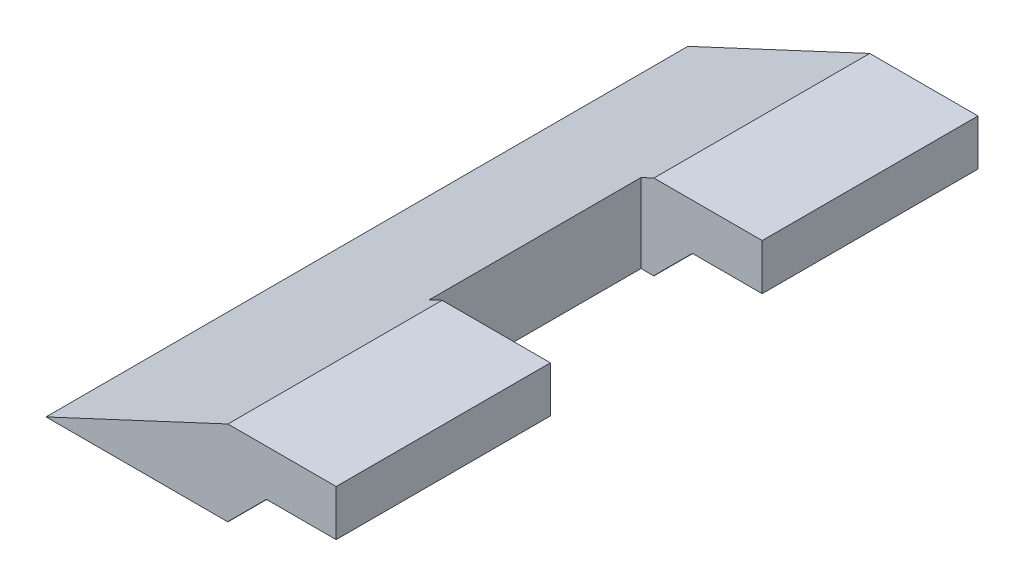
ISO-10303-21;
HEADER;
FILE_DESCRIPTION(('STEP AP214'),'2;1');
FILE_NAME('part.step','',(''),(''),'','','');
FILE_SCHEMA(('AUTOMOTIVE_DESIGN { 1 0 10303 214 1 1 1 1 }'));
ENDSEC;
DATA;
#1=APPLICATION_CONTEXT('core data for automotive mechanical design processes');
#2=APPLICATION_PROTOCOL_DEFINITION('international standard','automotive_design',2000,#1);
#3=PRODUCT_CONTEXT('',#1,'mechanical');
#4=PRODUCT('Part','Part','',(#3));
#5=PRODUCT_RELATED_PRODUCT_CATEGORY('part','',(#4));
#6=PRODUCT_DEFINITION_FORMATION('','',#4);
#7=PRODUCT_DEFINITION_CONTEXT('part definition',#1,'design');
#8=PRODUCT_DEFINITION('design','',#6,#7);
#9=PRODUCT_DEFINITION_SHAPE('','',#8);
#10=(LENGTH_UNIT() NAMED_UNIT(*) SI_UNIT(.MILLI.,.METRE.));
#11=(NAMED_UNIT(*) PLANE_ANGLE_UNIT() SI_UNIT($,.RADIAN.));
#12=(NAMED_UNIT(*) SI_UNIT($,.STERADIAN.) SOLID_ANGLE_UNIT());
#13=UNCERTAINTY_MEASURE_WITH_UNIT(LENGTH_MEASURE(1.E-05),#10,'distance_accuracy_value','');
#14=(GEOMETRIC_REPRESENTATION_CONTEXT(3) GLOBAL_UNCERTAINTY_ASSIGNED_CONTEXT((#13)) GLOBAL_UNIT_ASSIGNED_CONTEXT((#10,
#11,#12)) REPRESENTATION_CONTEXT('',''));
#15=CARTESIAN_POINT('',(0.,0.,0.));
#16=DIRECTION('',(0.,0.,1.));
#17=DIRECTION('',(1.,0.,0.));
#18=AXIS2_PLACEMENT_3D('',#15,#16,#17);
#19=CARTESIAN_POINT('',(-11.3020310443473,-4.30356435566631,50.));
#20=DIRECTION('',(0.,1.,0.));
#21=DIRECTION('',(-1.,0.,0.));
#22=AXIS2_PLACEMENT_3D('',#19,#20,#21);
#23=PLANE('',#22);
#24=DIRECTION('',(-1.,0.,0.));
#25=VECTOR('',#24,1.);
#26=CARTESIAN_POINT('',(-11.3020310443473,-4.30356435566631,33.3130553171228));
#27=LINE('',#26,#25);
#28=CARTESIAN_POINT('',(2.86700220180288,-4.3035643556663,33.3130553171228));
#29=VERTEX_POINT('',#28);
#30=CARTESIAN_POINT('',(1.86700220180288,-4.3035643556663,33.3130553171228));
#31=VERTEX_POINT('',#30);
#32=EDGE_CURVE('E144',#29,#31,#27,.T.);
#33=ORIENTED_EDGE('',*,*,#32,.F.);
#34=DIRECTION('',(0.,0.,-1.));
#35=VECTOR('',#34,1.);
#36=CARTESIAN_POINT('',(2.86700220180288,-4.3035643556663,50.));
#37=LINE('',#36,#35);
#38=CARTESIAN_POINT('',(2.86700220180288,-4.3035643556663,50.));
#39=VERTEX_POINT('',#38);
#40=EDGE_CURVE('E175',#39,#29,#37,.T.);
#41=ORIENTED_EDGE('',*,*,#40,.F.);
#42=DIRECTION('',(1.,0.,0.));
#43=VECTOR('',#42,1.);
#44=CARTESIAN_POINT('',(-11.3020310443473,-4.30356435566631,50.));
#45=LINE('',#44,#43);
#46=CARTESIAN_POINT('',(-11.3020310443473,-4.30356435566631,50.));
#47=VERTEX_POINT('',#46);
#48=EDGE_CURVE('E160',#47,#39,#45,.T.);
#49=ORIENTED_EDGE('',*,*,#48,.F.);
#50=DIRECTION('',(0.,0.,-1.));
#51=VECTOR('',#50,1.);
#52=CARTESIAN_POINT('',(-11.3020310443473,-4.30356435566631,50.));
#53=LINE('',#52,#51);
#54=CARTESIAN_POINT('',(-11.3020310443473,-4.30356435566631,0.));
#55=VERTEX_POINT('',#54);
#56=EDGE_CURVE('E136',#47,#55,#53,.T.);
#57=ORIENTED_EDGE('',*,*,#56,.T.);
#58=DIRECTION('',(1.,0.,0.));
#59=VECTOR('',#58,1.);
#60=CARTESIAN_POINT('',(-11.3020310443473,-4.30356435566631,0.));
#61=LINE('',#60,#59);
#62=CARTESIAN_POINT('',(2.86700220180288,-4.3035643556663,0.));
#63=VERTEX_POINT('',#62);
#64=EDGE_CURVE('E140',#55,#63,#61,.T.);
#65=ORIENTED_EDGE('',*,*,#64,.T.);
#66=CARTESIAN_POINT('',(2.86700220180288,-4.3035643556663,16.8130553171229));
#67=VERTEX_POINT('',#66);
#68=EDGE_CURVE('E174',#67,#63,#37,.T.);
#69=ORIENTED_EDGE('',*,*,#68,.F.);
#70=DIRECTION('',(1.,0.,0.));
#71=VECTOR('',#70,1.);
#72=CARTESIAN_POINT('',(-11.3020310443473,-4.30356435566631,16.8130553171229));
#73=LINE('',#72,#71);
#74=CARTESIAN_POINT('',(1.86700220180288,-4.3035643556663,16.8130553171229));
#75=VERTEX_POINT('',#74);
#76=EDGE_CURVE('E268',#75,#67,#73,.T.);
#77=ORIENTED_EDGE('',*,*,#76,.F.);
#78=DIRECTION('',(0.,0.,-1.));
#79=VECTOR('',#78,1.);
#80=CARTESIAN_POINT('',(1.86700220180288,-4.3035643556663,50.));
#81=LINE('',#80,#79);
#82=EDGE_CURVE('E222',#31,#75,#81,.T.);
#83=ORIENTED_EDGE('',*,*,#82,.F.);
#84=EDGE_LOOP('',(#33,#41,#49,#57,#65,#69,#77,#83));
#85=FACE_BOUND('',#84,.T.);
#86=ADVANCED_FACE('F35',(#85),#23,.F.);
#87=CARTESIAN_POINT('',(2.86700220180288,-4.3035643556663,50.));
#88=DIRECTION('',(-1.,0.,0.));
#89=DIRECTION('',(0.,0.,1.));
#90=AXIS2_PLACEMENT_3D('',#87,#88,#89);
#91=PLANE('',#90);
#92=DIRECTION('',(0.,-1.,0.));
#93=VECTOR('',#92,1.);
#94=CARTESIAN_POINT('',(2.86700220180288,-4.3035643556663,33.3130553171228));
#95=LINE('',#94,#93);
#96=CARTESIAN_POINT('',(2.86700220180288,-4.2824855787278,33.3130553171228));
#97=VERTEX_POINT('',#96);
#98=EDGE_CURVE('E216',#97,#29,#95,.T.);
#99=ORIENTED_EDGE('',*,*,#98,.F.);
#100=DIRECTION('',(0.,0.,-1.));
#101=VECTOR('',#100,1.);
#102=CARTESIAN_POINT('',(2.86700220180288,-4.2824855787278,50.));
#103=LINE('',#102,#101);
#104=CARTESIAN_POINT('',(2.86700220180288,-4.2824855787278,50.));
#105=VERTEX_POINT('',#104);
#106=EDGE_CURVE('E171',#105,#97,#103,.T.);
#107=ORIENTED_EDGE('',*,*,#106,.F.);
#108=DIRECTION('',(0.,1.,0.));
#109=VECTOR('',#108,1.);
#110=CARTESIAN_POINT('',(2.86700220180288,-4.3035643556663,50.));
#111=LINE('',#110,#109);
#112=EDGE_CURVE('E96',#39,#105,#111,.T.);
#113=ORIENTED_EDGE('',*,*,#112,.F.);
#114=ORIENTED_EDGE('',*,*,#40,.T.);
#115=EDGE_LOOP('',(#99,#107,#113,#114));
#116=FACE_BOUND('',#115,.T.);
#117=ADVANCED_FACE('F224',(#116),#91,.F.);
#118=DIRECTION('',(0.,1.,0.));
#119=VECTOR('',#118,1.);
#120=CARTESIAN_POINT('',(2.86700220180288,-4.3035643556663,16.8130553171229));
#121=LINE('',#120,#119);
#122=CARTESIAN_POINT('',(2.86700220180288,-4.2824855787278,16.8130553171229));
#123=VERTEX_POINT('',#122);
#124=EDGE_CURVE('E272',#67,#123,#121,.T.);
#125=ORIENTED_EDGE('',*,*,#124,.F.);
#126=ORIENTED_EDGE('',*,*,#68,.T.);
#127=DIRECTION('',(0.,1.,0.));
#128=VECTOR('',#127,1.);
#129=CARTESIAN_POINT('',(2.86700220180288,-4.3035643556663,0.));
#130=LINE('',#129,#128);
#131=CARTESIAN_POINT('',(2.86700220180288,-4.2824855787278,0.));
#132=VERTEX_POINT('',#131);
#133=EDGE_CURVE('E143',#63,#132,#130,.T.);
#134=ORIENTED_EDGE('',*,*,#133,.T.);
#135=EDGE_CURVE('E170',#123,#132,#103,.T.);
#136=ORIENTED_EDGE('',*,*,#135,.F.);
#137=EDGE_LOOP('',(#125,#126,#134,#136));
#138=FACE_BOUND('',#137,.T.);
#139=ADVANCED_FACE('F226',(#138),#91,.F.);
#140=CARTESIAN_POINT('',(2.86700220180288,-4.2824855787278,50.));
#141=DIRECTION('',(-0.70710678118655,0.707106781186545,0.));
#142=DIRECTION('',(-0.707106781186545,-0.70710678118655,0.));
#143=AXIS2_PLACEMENT_3D('',#140,#141,#142);
#144=PLANE('',#143);
#145=DIRECTION('',(-0.707106781186545,-0.70710678118655,0.));
#146=VECTOR('',#145,1.);
#147=CARTESIAN_POINT('',(2.86700220180288,-4.2824855787278,33.3130553171228));
#148=LINE('',#147,#146);
#149=CARTESIAN_POINT('',(5.86700220180288,-1.28248557872778,33.3130553171228));
#150=VERTEX_POINT('',#149);
#151=EDGE_CURVE('E214',#150,#97,#148,.T.);
#152=ORIENTED_EDGE('',*,*,#151,.F.);
#153=DIRECTION('',(0.,0.,-1.));
#154=VECTOR('',#153,1.);
#155=CARTESIAN_POINT('',(5.86700220180288,-1.28248557872778,50.));
#156=LINE('',#155,#154);
#157=CARTESIAN_POINT('',(5.86700220180288,-1.28248557872778,50.));
#158=VERTEX_POINT('',#157);
#159=EDGE_CURVE('E167',#158,#150,#156,.T.);
#160=ORIENTED_EDGE('',*,*,#159,.F.);
#161=DIRECTION('',(0.707106781186545,0.70710678118655,0.));
#162=VECTOR('',#161,1.);
#163=CARTESIAN_POINT('',(2.86700220180288,-4.2824855787278,50.));
#164=LINE('',#163,#162);
#165=EDGE_CURVE('E306',#105,#158,#164,.T.);
#166=ORIENTED_EDGE('',*,*,#165,.F.);
#167=ORIENTED_EDGE('',*,*,#106,.T.);
#168=EDGE_LOOP('',(#152,#160,#166,#167));
#169=FACE_BOUND('',#168,.T.);
#170=ADVANCED_FACE('F231',(#169),#144,.F.);
#171=DIRECTION('',(0.707106781186545,0.70710678118655,0.));
#172=VECTOR('',#171,1.);
#173=CARTESIAN_POINT('',(2.86700220180288,-4.2824855787278,16.8130553171229));
#174=LINE('',#173,#172);
#175=CARTESIAN_POINT('',(5.86700220180288,-1.28248557872778,16.8130553171229));
#176=VERTEX_POINT('',#175);
#177=EDGE_CURVE('E280',#123,#176,#174,.T.);
#178=ORIENTED_EDGE('',*,*,#177,.F.);
#179=ORIENTED_EDGE('',*,*,#135,.T.);
#180=DIRECTION('',(0.707106781186545,0.70710678118655,0.));
#181=VECTOR('',#180,1.);
#182=CARTESIAN_POINT('',(2.86700220180288,-4.2824855787278,0.));
#183=LINE('',#182,#181);
#184=CARTESIAN_POINT('',(5.86700220180288,-1.28248557872778,0.));
#185=VERTEX_POINT('',#184);
#186=EDGE_CURVE('E147',#132,#185,#183,.T.);
#187=ORIENTED_EDGE('',*,*,#186,.T.);
#188=EDGE_CURVE('E166',#176,#185,#156,.T.);
#189=ORIENTED_EDGE('',*,*,#188,.F.);
#190=EDGE_LOOP('',(#178,#179,#187,#189));
#191=FACE_BOUND('',#190,.T.);
#192=ADVANCED_FACE('F236',(#191),#144,.F.);
#193=CARTESIAN_POINT('',(5.86700220180288,-1.28248557872778,50.));
#194=DIRECTION('',(0.,1.,0.));
#195=DIRECTION('',(0.,0.,1.));
#196=AXIS2_PLACEMENT_3D('',#193,#194,#195);
#197=PLANE('',#196);
#198=DIRECTION('',(-1.,0.,0.));
#199=VECTOR('',#198,1.);
#200=CARTESIAN_POINT('',(5.86700220180288,-1.28248557872778,33.3130553171228));
#201=LINE('',#200,#199);
#202=CARTESIAN_POINT('',(11.3020310443473,-1.28248557872778,33.3130553171228));
#203=VERTEX_POINT('',#202);
#204=EDGE_CURVE('E301',#203,#150,#201,.T.);
#205=ORIENTED_EDGE('',*,*,#204,.F.);
#206=DIRECTION('',(0.,0.,-1.));
#207=VECTOR('',#206,1.);
#208=CARTESIAN_POINT('',(11.3020310443473,-1.28248557872778,50.));
#209=LINE('',#208,#207);
#210=CARTESIAN_POINT('',(11.3020310443473,-1.28248557872778,50.));
#211=VERTEX_POINT('',#210);
#212=EDGE_CURVE('E164',#211,#203,#209,.T.);
#213=ORIENTED_EDGE('',*,*,#212,.F.);
#214=DIRECTION('',(1.,0.,0.));
#215=VECTOR('',#214,1.);
#216=CARTESIAN_POINT('',(5.86700220180288,-1.28248557872778,50.));
#217=LINE('',#216,#215);
#218=EDGE_CURVE('E115',#158,#211,#217,.T.);
#219=ORIENTED_EDGE('',*,*,#218,.F.);
#220=ORIENTED_EDGE('',*,*,#159,.T.);
#221=EDGE_LOOP('',(#205,#213,#219,#220));
#222=FACE_BOUND('',#221,.T.);
#223=ADVANCED_FACE('F238',(#222),#197,.F.);
#224=DIRECTION('',(1.,0.,0.));
#225=VECTOR('',#224,1.);
#226=CARTESIAN_POINT('',(5.86700220180288,-1.28248557872778,16.8130553171229));
#227=LINE('',#226,#225);
#228=CARTESIAN_POINT('',(11.3020310443473,-1.28248557872778,16.8130553171229));
#229=VERTEX_POINT('',#228);
#230=EDGE_CURVE('E293',#176,#229,#227,.T.);
#231=ORIENTED_EDGE('',*,*,#230,.F.);
#232=ORIENTED_EDGE('',*,*,#188,.T.);
#233=DIRECTION('',(1.,0.,0.));
#234=VECTOR('',#233,1.);
#235=CARTESIAN_POINT('',(5.86700220180288,-1.28248557872778,0.));
#236=LINE('',#235,#234);
#237=CARTESIAN_POINT('',(11.3020310443473,-1.28248557872778,0.));
#238=VERTEX_POINT('',#237);
#239=EDGE_CURVE('E150',#185,#238,#236,.T.);
#240=ORIENTED_EDGE('',*,*,#239,.T.);
#241=EDGE_CURVE('E129',#229,#238,#209,.T.);
#242=ORIENTED_EDGE('',*,*,#241,.F.);
#243=EDGE_LOOP('',(#231,#232,#240,#242));
#244=FACE_BOUND('',#243,.T.);
#245=ADVANCED_FACE('F241',(#244),#197,.F.);
#246=CARTESIAN_POINT('',(11.3020310443473,-1.28248557872778,50.));
#247=DIRECTION('',(-1.,0.,0.));
#248=DIRECTION('',(0.,-1.,0.));
#249=AXIS2_PLACEMENT_3D('',#246,#247,#248);
#250=PLANE('',#249);
#251=DIRECTION('',(0.,1.,0.));
#252=VECTOR('',#251,1.);
#253=CARTESIAN_POINT('',(11.3020310443473,-11.2824855787278,33.3130553171228));
#254=LINE('',#253,#252);
#255=CARTESIAN_POINT('',(11.3020310443473,2.30356435566632,33.3130553171228));
#256=VERTEX_POINT('',#255);
#257=EDGE_CURVE('E126',#203,#256,#254,.T.);
#258=ORIENTED_EDGE('',*,*,#257,.T.);
#259=DIRECTION('',(0.,0.,-1.));
#260=VECTOR('',#259,1.);
#261=CARTESIAN_POINT('',(11.3020310443473,2.30356435566632,50.));
#262=LINE('',#261,#260);
#263=CARTESIAN_POINT('',(11.3020310443473,2.30356435566632,50.));
#264=VERTEX_POINT('',#263);
#265=EDGE_CURVE('E122',#264,#256,#262,.T.);
#266=ORIENTED_EDGE('',*,*,#265,.F.);
#267=DIRECTION('',(0.,1.,0.));
#268=VECTOR('',#267,1.);
#269=CARTESIAN_POINT('',(11.3020310443473,-1.28248557872778,50.));
#270=LINE('',#269,#268);
#271=EDGE_CURVE('E108',#211,#264,#270,.T.);
#272=ORIENTED_EDGE('',*,*,#271,.F.);
#273=ORIENTED_EDGE('',*,*,#212,.T.);
#274=EDGE_LOOP('',(#258,#266,#272,#273));
#275=FACE_BOUND('',#274,.T.);
#276=ADVANCED_FACE('F123',(#275),#250,.F.);
#277=DIRECTION('',(0.,1.,0.));
#278=VECTOR('',#277,1.);
#279=CARTESIAN_POINT('',(11.3020310443473,-11.2824855787278,16.8130553171229));
#280=LINE('',#279,#278);
#281=CARTESIAN_POINT('',(11.3020310443473,2.30356435566632,16.8130553171229));
#282=VERTEX_POINT('',#281);
#283=EDGE_CURVE('E324',#229,#282,#280,.T.);
#284=ORIENTED_EDGE('',*,*,#283,.F.);
#285=ORIENTED_EDGE('',*,*,#241,.T.);
#286=DIRECTION('',(0.,1.,0.));
#287=VECTOR('',#286,1.);
#288=CARTESIAN_POINT('',(11.3020310443473,-1.28248557872778,0.));
#289=LINE('',#288,#287);
#290=CARTESIAN_POINT('',(11.3020310443473,2.30356435566632,0.));
#291=VERTEX_POINT('',#290);
#292=EDGE_CURVE('E153',#238,#291,#289,.T.);
#293=ORIENTED_EDGE('',*,*,#292,.T.);
#294=EDGE_CURVE('E130',#282,#291,#262,.T.);
#295=ORIENTED_EDGE('',*,*,#294,.F.);
#296=EDGE_LOOP('',(#284,#285,#293,#295));
#297=FACE_BOUND('',#296,.T.);
#298=ADVANCED_FACE('F245',(#297),#250,.F.);
#299=CARTESIAN_POINT('',(11.3020310443473,2.30356435566632,50.));
#300=DIRECTION('',(0.,-1.,0.));
#301=DIRECTION('',(0.,0.,-1.));
#302=AXIS2_PLACEMENT_3D('',#299,#300,#301);
#303=PLANE('',#302);
#304=DIRECTION('',(1.,0.,0.));
#305=VECTOR('',#304,1.);
#306=CARTESIAN_POINT('',(11.3020310443473,2.30356435566632,33.3130553171228));
#307=LINE('',#306,#305);
#308=CARTESIAN_POINT('',(2.86700220180287,2.30356435566632,33.3130553171228));
#309=VERTEX_POINT('',#308);
#310=EDGE_CURVE('E299',#309,#256,#307,.T.);
#311=ORIENTED_EDGE('',*,*,#310,.F.);
#312=DIRECTION('',(0.,0.,-1.));
#313=VECTOR('',#312,1.);
#314=CARTESIAN_POINT('',(2.86700220180287,2.30356435566632,50.));
#315=LINE('',#314,#313);
#316=CARTESIAN_POINT('',(2.86700220180287,2.30356435566632,50.));
#317=VERTEX_POINT('',#316);
#318=EDGE_CURVE('E134',#317,#309,#315,.T.);
#319=ORIENTED_EDGE('',*,*,#318,.F.);
#320=DIRECTION('',(-1.,0.,0.));
#321=VECTOR('',#320,1.);
#322=CARTESIAN_POINT('',(11.3020310443473,2.30356435566632,50.));
#323=LINE('',#322,#321);
#324=EDGE_CURVE('E112',#264,#317,#323,.T.);
#325=ORIENTED_EDGE('',*,*,#324,.F.);
#326=ORIENTED_EDGE('',*,*,#265,.T.);
#327=EDGE_LOOP('',(#311,#319,#325,#326));
#328=FACE_BOUND('',#327,.T.);
#329=ADVANCED_FACE('F132',(#328),#303,.F.);
#330=DIRECTION('',(-1.,0.,0.));
#331=VECTOR('',#330,1.);
#332=CARTESIAN_POINT('',(11.3020310443473,2.30356435566632,16.8130553171229));
#333=LINE('',#332,#331);
#334=CARTESIAN_POINT('',(2.86700220180287,2.30356435566632,16.8130553171229));
#335=VERTEX_POINT('',#334);
#336=EDGE_CURVE('E49',#282,#335,#333,.T.);
#337=ORIENTED_EDGE('',*,*,#336,.F.);
#338=ORIENTED_EDGE('',*,*,#294,.T.);
#339=DIRECTION('',(-1.,0.,0.));
#340=VECTOR('',#339,1.);
#341=CARTESIAN_POINT('',(11.3020310443473,2.30356435566632,0.));
#342=LINE('',#341,#340);
#343=CARTESIAN_POINT('',(2.86700220180287,2.30356435566632,0.));
#344=VERTEX_POINT('',#343);
#345=EDGE_CURVE('E156',#291,#344,#342,.T.);
#346=ORIENTED_EDGE('',*,*,#345,.T.);
#347=EDGE_CURVE('E162',#335,#344,#315,.T.);
#348=ORIENTED_EDGE('',*,*,#347,.F.);
#349=EDGE_LOOP('',(#337,#338,#346,#348));
#350=FACE_BOUND('',#349,.T.);
#351=ADVANCED_FACE('F248',(#350),#303,.F.);
#352=CARTESIAN_POINT('',(2.86700220180287,2.30356435566632,50.));
#353=DIRECTION('',(0.422618261740702,-0.906307787036649,0.));
#354=DIRECTION('',(0.906307787036649,0.422618261740702,0.));
#355=AXIS2_PLACEMENT_3D('',#352,#353,#354);
#356=PLANE('',#355);
#357=DIRECTION('',(0.906307787036649,0.422618261740702,0.));
#358=VECTOR('',#357,1.);
#359=CARTESIAN_POINT('',(2.86700220180287,2.30356435566632,33.3130553171228));
#360=LINE('',#359,#358);
#361=CARTESIAN_POINT('',(1.86700220180288,1.83725669751133,33.3130553171228));
#362=VERTEX_POINT('',#361);
#363=EDGE_CURVE('E11',#362,#309,#360,.T.);
#364=ORIENTED_EDGE('',*,*,#363,.F.);
#365=DIRECTION('',(0.,0.,1.));
#366=VECTOR('',#365,1.);
#367=CARTESIAN_POINT('',(1.86700220180288,1.83725669751132,50.));
#368=LINE('',#367,#366);
#369=CARTESIAN_POINT('',(1.86700220180288,1.83725669751132,16.8130553171229));
#370=VERTEX_POINT('',#369);
#371=EDGE_CURVE('E42',#370,#362,#368,.T.);
#372=ORIENTED_EDGE('',*,*,#371,.F.);
#373=DIRECTION('',(-0.906307787036649,-0.422618261740702,0.));
#374=VECTOR('',#373,1.);
#375=CARTESIAN_POINT('',(2.86700220180287,2.30356435566632,16.8130553171229));
#376=LINE('',#375,#374);
#377=EDGE_CURVE('E177',#335,#370,#376,.T.);
#378=ORIENTED_EDGE('',*,*,#377,.F.);
#379=ORIENTED_EDGE('',*,*,#347,.T.);
#380=DIRECTION('',(-0.906307787036649,-0.422618261740702,0.));
#381=VECTOR('',#380,1.);
#382=CARTESIAN_POINT('',(2.86700220180287,2.30356435566632,0.));
#383=LINE('',#382,#381);
#384=EDGE_CURVE('E87',#344,#55,#383,.T.);
#385=ORIENTED_EDGE('',*,*,#384,.T.);
#386=ORIENTED_EDGE('',*,*,#56,.F.);
#387=DIRECTION('',(-0.906307787036649,-0.422618261740702,0.));
#388=VECTOR('',#387,1.);
#389=CARTESIAN_POINT('',(2.86700220180287,2.30356435566632,50.));
#390=LINE('',#389,#388);
#391=EDGE_CURVE('E58',#317,#47,#390,.T.);
#392=ORIENTED_EDGE('',*,*,#391,.F.);
#393=ORIENTED_EDGE('',*,*,#318,.T.);
#394=EDGE_LOOP('',(#364,#372,#378,#379,#385,#386,#392,#393));
#395=FACE_BOUND('',#394,.T.);
#396=ADVANCED_FACE('F204',(#395),#356,.F.);
#397=CARTESIAN_POINT('',(0.,0.,50.));
#398=DIRECTION('',(0.,0.,1.));
#399=DIRECTION('',(1.,0.,0.));
#400=AXIS2_PLACEMENT_3D('',#397,#398,#399);
#401=PLANE('',#400);
#402=ORIENTED_EDGE('',*,*,#48,.T.);
#403=ORIENTED_EDGE('',*,*,#112,.T.);
#404=ORIENTED_EDGE('',*,*,#165,.T.);
#405=ORIENTED_EDGE('',*,*,#218,.T.);
#406=ORIENTED_EDGE('',*,*,#271,.T.);
#407=ORIENTED_EDGE('',*,*,#324,.T.);
#408=ORIENTED_EDGE('',*,*,#391,.T.);
#409=EDGE_LOOP('',(#402,#403,#404,#405,#406,#407,#408));
#410=FACE_BOUND('',#409,.T.);
#411=ADVANCED_FACE('F110',(#410),#401,.T.);
#412=CARTESIAN_POINT('',(0.,0.,0.));
#413=DIRECTION('',(0.,0.,1.));
#414=DIRECTION('',(1.,0.,0.));
#415=AXIS2_PLACEMENT_3D('',#412,#413,#414);
#416=PLANE('',#415);
#417=ORIENTED_EDGE('',*,*,#64,.F.);
#418=ORIENTED_EDGE('',*,*,#384,.F.);
#419=ORIENTED_EDGE('',*,*,#345,.F.);
#420=ORIENTED_EDGE('',*,*,#292,.F.);
#421=ORIENTED_EDGE('',*,*,#239,.F.);
#422=ORIENTED_EDGE('',*,*,#186,.F.);
#423=ORIENTED_EDGE('',*,*,#133,.F.);
#424=EDGE_LOOP('',(#417,#418,#419,#420,#421,#422,#423));
#425=FACE_BOUND('',#424,.T.);
#426=ADVANCED_FACE('F251',(#425),#416,.F.);
#427=CARTESIAN_POINT('',(11.3020310443473,-11.2824855787278,33.3130553171228));
#428=DIRECTION('',(0.,0.,-1.));
#429=DIRECTION('',(-1.,0.,0.));
#430=AXIS2_PLACEMENT_3D('',#427,#428,#429);
#431=PLANE('',#430);
#432=ORIENTED_EDGE('',*,*,#32,.T.);
#433=DIRECTION('',(0.,1.,0.));
#434=VECTOR('',#433,1.);
#435=CARTESIAN_POINT('',(1.86700220180288,-11.2824855787278,33.3130553171228));
#436=LINE('',#435,#434);
#437=EDGE_CURVE('E188',#31,#362,#436,.T.);
#438=ORIENTED_EDGE('',*,*,#437,.T.);
#439=ORIENTED_EDGE('',*,*,#363,.T.);
#440=ORIENTED_EDGE('',*,*,#310,.T.);
#441=ORIENTED_EDGE('',*,*,#257,.F.);
#442=ORIENTED_EDGE('',*,*,#204,.T.);
#443=ORIENTED_EDGE('',*,*,#151,.T.);
#444=ORIENTED_EDGE('',*,*,#98,.T.);
#445=EDGE_LOOP('',(#432,#438,#439,#440,#441,#442,#443,#444));
#446=FACE_BOUND('',#445,.T.);
#447=ADVANCED_FACE('F198',(#446),#431,.T.);
#448=CARTESIAN_POINT('',(1.86700220180288,-11.2824855787278,16.8130553171229));
#449=DIRECTION('',(1.,0.,0.));
#450=DIRECTION('',(0.,0.,-1.));
#451=AXIS2_PLACEMENT_3D('',#448,#449,#450);
#452=PLANE('',#451);
#453=ORIENTED_EDGE('',*,*,#82,.T.);
#454=DIRECTION('',(0.,1.,0.));
#455=VECTOR('',#454,1.);
#456=CARTESIAN_POINT('',(1.86700220180288,-11.2824855787278,16.8130553171229));
#457=LINE('',#456,#455);
#458=EDGE_CURVE('E192',#75,#370,#457,.T.);
#459=ORIENTED_EDGE('',*,*,#458,.T.);
#460=ORIENTED_EDGE('',*,*,#371,.T.);
#461=ORIENTED_EDGE('',*,*,#437,.F.);
#462=EDGE_LOOP('',(#453,#459,#460,#461));
#463=FACE_BOUND('',#462,.T.);
#464=ADVANCED_FACE('F186',(#463),#452,.T.);
#465=CARTESIAN_POINT('',(11.3020310443473,-11.2824855787278,16.8130553171229));
#466=DIRECTION('',(0.,0.,1.));
#467=DIRECTION('',(1.,0.,0.));
#468=AXIS2_PLACEMENT_3D('',#465,#466,#467);
#469=PLANE('',#468);
#470=ORIENTED_EDGE('',*,*,#76,.T.);
#471=ORIENTED_EDGE('',*,*,#124,.T.);
#472=ORIENTED_EDGE('',*,*,#177,.T.);
#473=ORIENTED_EDGE('',*,*,#230,.T.);
#474=ORIENTED_EDGE('',*,*,#283,.T.);
#475=ORIENTED_EDGE('',*,*,#336,.T.);
#476=ORIENTED_EDGE('',*,*,#377,.T.);
#477=ORIENTED_EDGE('',*,*,#458,.F.);
#478=EDGE_LOOP('',(#470,#471,#472,#473,#474,#475,#476,#477));
#479=FACE_BOUND('',#478,.T.);
#480=ADVANCED_FACE('F261',(#479),#469,.T.);
#481=CLOSED_SHELL('',(#86,#117,#139,#170,#192,#223,#245,#276,#298,#329,#351,#396,#411,#426,#447,
#464,#480));
#482=MANIFOLD_SOLID_BREP('B2',#481);
#483=ADVANCED_BREP_SHAPE_REPRESENTATION('',(#18,#482),#14);
#484=SHAPE_DEFINITION_REPRESENTATION(#9,#483);
ENDSEC;
END-ISO-10303-21;
